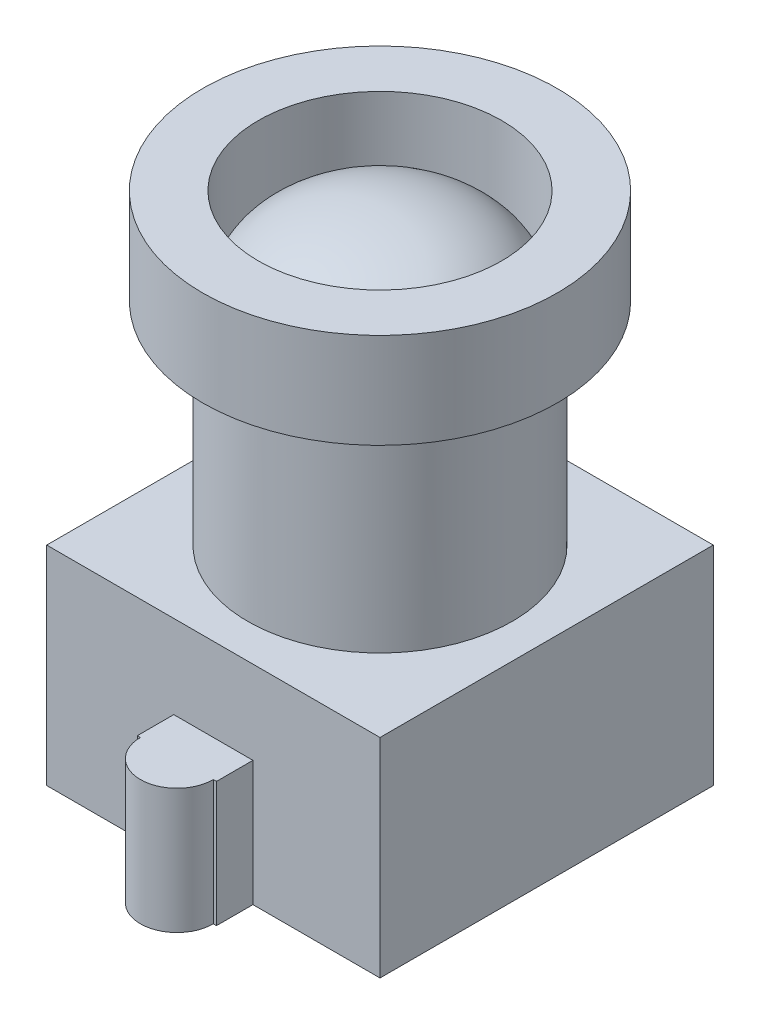
ISO-10303-21;
HEADER;
FILE_DESCRIPTION(('STEP AP214'),'2;1');
FILE_NAME('part.step','',(''),(''),'','','');
FILE_SCHEMA(('AUTOMOTIVE_DESIGN { 1 0 10303 214 1 1 1 1 }'));
ENDSEC;
DATA;
#1=APPLICATION_CONTEXT('core data for automotive mechanical design processes');
#2=APPLICATION_PROTOCOL_DEFINITION('international standard','automotive_design',2000,#1);
#3=PRODUCT_CONTEXT('',#1,'mechanical');
#4=PRODUCT('Part','Part','',(#3));
#5=PRODUCT_RELATED_PRODUCT_CATEGORY('part','',(#4));
#6=PRODUCT_DEFINITION_FORMATION('','',#4);
#7=PRODUCT_DEFINITION_CONTEXT('part definition',#1,'design');
#8=PRODUCT_DEFINITION('design','',#6,#7);
#9=PRODUCT_DEFINITION_SHAPE('','',#8);
#10=(LENGTH_UNIT() NAMED_UNIT(*) SI_UNIT(.MILLI.,.METRE.));
#11=(NAMED_UNIT(*) PLANE_ANGLE_UNIT() SI_UNIT($,.RADIAN.));
#12=(NAMED_UNIT(*) SI_UNIT($,.STERADIAN.) SOLID_ANGLE_UNIT());
#13=UNCERTAINTY_MEASURE_WITH_UNIT(LENGTH_MEASURE(1.E-05),#10,'distance_accuracy_value','');
#14=(GEOMETRIC_REPRESENTATION_CONTEXT(3) GLOBAL_UNCERTAINTY_ASSIGNED_CONTEXT((#13)) GLOBAL_UNIT_ASSIGNED_CONTEXT((#10,
#11,#12)) REPRESENTATION_CONTEXT('',''));
#15=CARTESIAN_POINT('',(0.,0.,0.));
#16=DIRECTION('',(0.,0.,1.));
#17=DIRECTION('',(1.,0.,0.));
#18=AXIS2_PLACEMENT_3D('',#15,#16,#17);
#19=CARTESIAN_POINT('',(-8.,11.6,-8.));
#20=DIRECTION('',(0.,0.,-1.));
#21=DIRECTION('',(-1.,0.,0.));
#22=AXIS2_PLACEMENT_3D('',#19,#20,#21);
#23=PLANE('',#22);
#24=DIRECTION('',(0.,-1.,0.));
#25=VECTOR('',#24,1.);
#26=CARTESIAN_POINT('',(1.9,7.6,-8.));
#27=LINE('',#26,#25);
#28=CARTESIAN_POINT('',(1.9,7.6,-8.));
#29=VERTEX_POINT('',#28);
#30=CARTESIAN_POINT('',(1.9,1.6,-8.));
#31=VERTEX_POINT('',#30);
#32=EDGE_CURVE('E161',#29,#31,#27,.T.);
#33=ORIENTED_EDGE('',*,*,#32,.F.);
#34=DIRECTION('',(1.,0.,0.));
#35=VECTOR('',#34,1.);
#36=CARTESIAN_POINT('',(-1.9,7.6,-8.));
#37=LINE('',#36,#35);
#38=CARTESIAN_POINT('',(-1.9,7.6,-8.));
#39=VERTEX_POINT('',#38);
#40=EDGE_CURVE('E148',#39,#29,#37,.T.);
#41=ORIENTED_EDGE('',*,*,#40,.F.);
#42=DIRECTION('',(0.,-1.,0.));
#43=VECTOR('',#42,1.);
#44=CARTESIAN_POINT('',(-1.9,7.6,-8.));
#45=LINE('',#44,#43);
#46=CARTESIAN_POINT('',(-1.9,1.6,-8.));
#47=VERTEX_POINT('',#46);
#48=EDGE_CURVE('E170',#39,#47,#45,.T.);
#49=ORIENTED_EDGE('',*,*,#48,.T.);
#50=DIRECTION('',(1.,0.,0.));
#51=VECTOR('',#50,1.);
#52=CARTESIAN_POINT('',(-8.,1.6,-8.));
#53=LINE('',#52,#51);
#54=CARTESIAN_POINT('',(-8.,1.6,-8.));
#55=VERTEX_POINT('',#54);
#56=EDGE_CURVE('E238',#55,#47,#53,.T.);
#57=ORIENTED_EDGE('',*,*,#56,.F.);
#58=DIRECTION('',(0.,-1.,0.));
#59=VECTOR('',#58,1.);
#60=CARTESIAN_POINT('',(-8.,11.6,-8.));
#61=LINE('',#60,#59);
#62=CARTESIAN_POINT('',(-8.,11.6,-8.));
#63=VERTEX_POINT('',#62);
#64=EDGE_CURVE('E250',#63,#55,#61,.T.);
#65=ORIENTED_EDGE('',*,*,#64,.F.);
#66=DIRECTION('',(1.,0.,0.));
#67=VECTOR('',#66,1.);
#68=CARTESIAN_POINT('',(-8.,11.6,-8.));
#69=LINE('',#68,#67);
#70=CARTESIAN_POINT('',(8.,11.6,-8.));
#71=VERTEX_POINT('',#70);
#72=EDGE_CURVE('E224',#63,#71,#69,.T.);
#73=ORIENTED_EDGE('',*,*,#72,.T.);
#74=DIRECTION('',(0.,-1.,0.));
#75=VECTOR('',#74,1.);
#76=CARTESIAN_POINT('',(8.,11.6,-8.));
#77=LINE('',#76,#75);
#78=CARTESIAN_POINT('',(8.,1.6,-8.));
#79=VERTEX_POINT('',#78);
#80=EDGE_CURVE('E237',#71,#79,#77,.T.);
#81=ORIENTED_EDGE('',*,*,#80,.T.);
#82=EDGE_CURVE('E169',#31,#79,#53,.T.);
#83=ORIENTED_EDGE('',*,*,#82,.F.);
#84=EDGE_LOOP('',(#33,#41,#49,#57,#65,#73,#81,#83));
#85=FACE_BOUND('',#84,.T.);
#86=ADVANCED_FACE('F32',(#85),#23,.T.);
#87=CARTESIAN_POINT('',(-8.,11.6,8.));
#88=DIRECTION('',(-1.,0.,0.));
#89=DIRECTION('',(0.,0.,1.));
#90=AXIS2_PLACEMENT_3D('',#87,#88,#89);
#91=PLANE('',#90);
#92=DIRECTION('',(0.,0.,-1.));
#93=VECTOR('',#92,1.);
#94=CARTESIAN_POINT('',(-8.,1.6,8.));
#95=LINE('',#94,#93);
#96=CARTESIAN_POINT('',(-8.,1.6,8.));
#97=VERTEX_POINT('',#96);
#98=EDGE_CURVE('E228',#97,#55,#95,.T.);
#99=ORIENTED_EDGE('',*,*,#98,.F.);
#100=DIRECTION('',(0.,-1.,0.));
#101=VECTOR('',#100,1.);
#102=CARTESIAN_POINT('',(-8.,11.6,8.));
#103=LINE('',#102,#101);
#104=CARTESIAN_POINT('',(-8.,11.6,8.));
#105=VERTEX_POINT('',#104);
#106=EDGE_CURVE('E252',#105,#97,#103,.T.);
#107=ORIENTED_EDGE('',*,*,#106,.F.);
#108=DIRECTION('',(0.,0.,-1.));
#109=VECTOR('',#108,1.);
#110=CARTESIAN_POINT('',(-8.,11.6,8.));
#111=LINE('',#110,#109);
#112=EDGE_CURVE('E234',#105,#63,#111,.T.);
#113=ORIENTED_EDGE('',*,*,#112,.T.);
#114=ORIENTED_EDGE('',*,*,#64,.T.);
#115=EDGE_LOOP('',(#99,#107,#113,#114));
#116=FACE_BOUND('',#115,.T.);
#117=ADVANCED_FACE('F275',(#116),#91,.T.);
#118=CARTESIAN_POINT('',(8.,11.6,8.));
#119=DIRECTION('',(0.,0.,1.));
#120=DIRECTION('',(1.,0.,0.));
#121=AXIS2_PLACEMENT_3D('',#118,#119,#120);
#122=PLANE('',#121);
#123=DIRECTION('',(0.,-1.,0.));
#124=VECTOR('',#123,1.);
#125=CARTESIAN_POINT('',(-1.9,7.6,8.));
#126=LINE('',#125,#124);
#127=CARTESIAN_POINT('',(-1.9,7.6,8.));
#128=VERTEX_POINT('',#127);
#129=CARTESIAN_POINT('',(-1.9,1.6,8.));
#130=VERTEX_POINT('',#129);
#131=EDGE_CURVE('E215',#128,#130,#126,.T.);
#132=ORIENTED_EDGE('',*,*,#131,.F.);
#133=DIRECTION('',(1.,0.,0.));
#134=VECTOR('',#133,1.);
#135=CARTESIAN_POINT('',(-1.9,7.6,8.));
#136=LINE('',#135,#134);
#137=CARTESIAN_POINT('',(1.9,7.6,8.));
#138=VERTEX_POINT('',#137);
#139=EDGE_CURVE('E194',#128,#138,#136,.T.);
#140=ORIENTED_EDGE('',*,*,#139,.T.);
#141=DIRECTION('',(0.,-1.,0.));
#142=VECTOR('',#141,1.);
#143=CARTESIAN_POINT('',(1.9,7.6,8.));
#144=LINE('',#143,#142);
#145=CARTESIAN_POINT('',(1.9,1.6,8.));
#146=VERTEX_POINT('',#145);
#147=EDGE_CURVE('E212',#138,#146,#144,.T.);
#148=ORIENTED_EDGE('',*,*,#147,.T.);
#149=DIRECTION('',(-1.,0.,0.));
#150=VECTOR('',#149,1.);
#151=CARTESIAN_POINT('',(8.,1.6,8.));
#152=LINE('',#151,#150);
#153=CARTESIAN_POINT('',(8.,1.6,8.));
#154=VERTEX_POINT('',#153);
#155=EDGE_CURVE('E245',#154,#146,#152,.T.);
#156=ORIENTED_EDGE('',*,*,#155,.F.);
#157=DIRECTION('',(0.,-1.,0.));
#158=VECTOR('',#157,1.);
#159=CARTESIAN_POINT('',(8.,11.6,8.));
#160=LINE('',#159,#158);
#161=CARTESIAN_POINT('',(8.,11.6,8.));
#162=VERTEX_POINT('',#161);
#163=EDGE_CURVE('E255',#162,#154,#160,.T.);
#164=ORIENTED_EDGE('',*,*,#163,.F.);
#165=DIRECTION('',(-1.,0.,0.));
#166=VECTOR('',#165,1.);
#167=CARTESIAN_POINT('',(8.,11.6,8.));
#168=LINE('',#167,#166);
#169=EDGE_CURVE('E231',#162,#105,#168,.T.);
#170=ORIENTED_EDGE('',*,*,#169,.T.);
#171=ORIENTED_EDGE('',*,*,#106,.T.);
#172=EDGE_CURVE('E244',#130,#97,#152,.T.);
#173=ORIENTED_EDGE('',*,*,#172,.F.);
#174=EDGE_LOOP('',(#132,#140,#148,#156,#164,#170,#171,#173));
#175=FACE_BOUND('',#174,.T.);
#176=ADVANCED_FACE('F280',(#175),#122,.T.);
#177=CARTESIAN_POINT('',(8.,11.6,-8.));
#178=DIRECTION('',(1.,0.,0.));
#179=DIRECTION('',(0.,0.,-1.));
#180=AXIS2_PLACEMENT_3D('',#177,#178,#179);
#181=PLANE('',#180);
#182=DIRECTION('',(0.,0.,1.));
#183=VECTOR('',#182,1.);
#184=CARTESIAN_POINT('',(8.,1.6,-8.));
#185=LINE('',#184,#183);
#186=EDGE_CURVE('E241',#79,#154,#185,.T.);
#187=ORIENTED_EDGE('',*,*,#186,.F.);
#188=ORIENTED_EDGE('',*,*,#80,.F.);
#189=DIRECTION('',(0.,0.,1.));
#190=VECTOR('',#189,1.);
#191=CARTESIAN_POINT('',(8.,11.6,-8.));
#192=LINE('',#191,#190);
#193=EDGE_CURVE('E227',#71,#162,#192,.T.);
#194=ORIENTED_EDGE('',*,*,#193,.T.);
#195=ORIENTED_EDGE('',*,*,#163,.T.);
#196=EDGE_LOOP('',(#187,#188,#194,#195));
#197=FACE_BOUND('',#196,.T.);
#198=ADVANCED_FACE('F267',(#197),#181,.T.);
#199=CARTESIAN_POINT('',(0.,11.6,0.));
#200=DIRECTION('',(0.,-1.,0.));
#201=DIRECTION('',(0.,0.,-1.));
#202=AXIS2_PLACEMENT_3D('',#199,#200,#201);
#203=PLANE('',#202);
#204=CARTESIAN_POINT('',(0.,11.6,0.));
#205=DIRECTION('',(0.,-1.,0.));
#206=DIRECTION('',(0.,0.,-1.));
#207=AXIS2_PLACEMENT_3D('',#204,#205,#206);
#208=CIRCLE('',#207,6.35);
#209=CARTESIAN_POINT('',(0.,11.6,-6.35));
#210=VERTEX_POINT('',#209);
#211=EDGE_CURVE('E41',#210,#210,#208,.F.);
#212=ORIENTED_EDGE('',*,*,#211,.F.);
#213=EDGE_LOOP('',(#212));
#214=FACE_BOUND('',#213,.T.);
#215=ORIENTED_EDGE('',*,*,#72,.F.);
#216=ORIENTED_EDGE('',*,*,#112,.F.);
#217=ORIENTED_EDGE('',*,*,#169,.F.);
#218=ORIENTED_EDGE('',*,*,#193,.F.);
#219=EDGE_LOOP('',(#215,#216,#217,#218));
#220=FACE_BOUND('',#219,.T.);
#221=ADVANCED_FACE('F263',(#214,#220),#203,.F.);
#222=CARTESIAN_POINT('',(0.,1.6,0.));
#223=DIRECTION('',(0.,-1.,0.));
#224=DIRECTION('',(0.,0.,-1.));
#225=AXIS2_PLACEMENT_3D('',#222,#223,#224);
#226=PLANE('',#225);
#227=ORIENTED_EDGE('',*,*,#56,.T.);
#228=DIRECTION('',(0.,0.,1.));
#229=VECTOR('',#228,1.);
#230=CARTESIAN_POINT('',(-1.9,1.6,-9.75));
#231=LINE('',#230,#229);
#232=CARTESIAN_POINT('',(-1.9,1.6,-9.75));
#233=VERTEX_POINT('',#232);
#234=EDGE_CURVE('E51',#233,#47,#231,.T.);
#235=ORIENTED_EDGE('',*,*,#234,.F.);
#236=DIRECTION('',(-1.,0.,0.));
#237=VECTOR('',#236,1.);
#238=CARTESIAN_POINT('',(-1.75,1.6,-9.75));
#239=LINE('',#238,#237);
#240=CARTESIAN_POINT('',(-1.75,1.6,-9.75));
#241=VERTEX_POINT('',#240);
#242=EDGE_CURVE('E289',#241,#233,#239,.T.);
#243=ORIENTED_EDGE('',*,*,#242,.F.);
#244=CARTESIAN_POINT('',(0.,1.6,-9.75));
#245=DIRECTION('',(0.,1.,0.));
#246=DIRECTION('',(0.,0.,1.));
#247=AXIS2_PLACEMENT_3D('',#244,#245,#246);
#248=CIRCLE('',#247,1.75);
#249=CARTESIAN_POINT('',(1.75,1.6,-9.75));
#250=VERTEX_POINT('',#249);
#251=EDGE_CURVE('E297',#250,#241,#248,.T.);
#252=ORIENTED_EDGE('',*,*,#251,.F.);
#253=DIRECTION('',(-1.,0.,0.));
#254=VECTOR('',#253,1.);
#255=CARTESIAN_POINT('',(1.9,1.6,-9.75));
#256=LINE('',#255,#254);
#257=CARTESIAN_POINT('',(1.9,1.6,-9.75));
#258=VERTEX_POINT('',#257);
#259=EDGE_CURVE('E165',#258,#250,#256,.T.);
#260=ORIENTED_EDGE('',*,*,#259,.F.);
#261=DIRECTION('',(0.,0.,-1.));
#262=VECTOR('',#261,1.);
#263=CARTESIAN_POINT('',(1.9,1.6,-8.));
#264=LINE('',#263,#262);
#265=EDGE_CURVE('E285',#31,#258,#264,.T.);
#266=ORIENTED_EDGE('',*,*,#265,.F.);
#267=ORIENTED_EDGE('',*,*,#82,.T.);
#268=ORIENTED_EDGE('',*,*,#186,.T.);
#269=ORIENTED_EDGE('',*,*,#155,.T.);
#270=DIRECTION('',(0.,0.,1.));
#271=VECTOR('',#270,1.);
#272=CARTESIAN_POINT('',(1.9,1.6,8.));
#273=LINE('',#272,#271);
#274=CARTESIAN_POINT('',(1.9,1.6,9.75));
#275=VERTEX_POINT('',#274);
#276=EDGE_CURVE('E198',#146,#275,#273,.T.);
#277=ORIENTED_EDGE('',*,*,#276,.T.);
#278=DIRECTION('',(-1.,0.,0.));
#279=VECTOR('',#278,1.);
#280=CARTESIAN_POINT('',(1.9,1.6,9.75));
#281=LINE('',#280,#279);
#282=CARTESIAN_POINT('',(1.75,1.6,9.75));
#283=VERTEX_POINT('',#282);
#284=EDGE_CURVE('E201',#275,#283,#281,.T.);
#285=ORIENTED_EDGE('',*,*,#284,.T.);
#286=CARTESIAN_POINT('',(0.,1.6,9.75));
#287=DIRECTION('',(0.,-1.,0.));
#288=DIRECTION('',(0.,0.,-1.));
#289=AXIS2_PLACEMENT_3D('',#286,#287,#288);
#290=CIRCLE('',#289,1.75);
#291=CARTESIAN_POINT('',(-1.75,1.6,9.75));
#292=VERTEX_POINT('',#291);
#293=EDGE_CURVE('E204',#283,#292,#290,.T.);
#294=ORIENTED_EDGE('',*,*,#293,.T.);
#295=DIRECTION('',(-1.,0.,0.));
#296=VECTOR('',#295,1.);
#297=CARTESIAN_POINT('',(-1.75,1.6,9.75));
#298=LINE('',#297,#296);
#299=CARTESIAN_POINT('',(-1.9,1.6,9.75));
#300=VERTEX_POINT('',#299);
#301=EDGE_CURVE('E207',#292,#300,#298,.T.);
#302=ORIENTED_EDGE('',*,*,#301,.T.);
#303=DIRECTION('',(0.,0.,-1.));
#304=VECTOR('',#303,1.);
#305=CARTESIAN_POINT('',(-1.9,1.6,9.75));
#306=LINE('',#305,#304);
#307=EDGE_CURVE('E183',#300,#130,#306,.T.);
#308=ORIENTED_EDGE('',*,*,#307,.T.);
#309=ORIENTED_EDGE('',*,*,#172,.T.);
#310=ORIENTED_EDGE('',*,*,#98,.T.);
#311=EDGE_LOOP('',(#227,#235,#243,#252,#260,#266,#267,#268,#269,#277,#285,#294,#302,#308,#309,#310));
#312=FACE_BOUND('',#311,.T.);
#313=ADVANCED_FACE('F266',(#312),#226,.T.);
#314=CARTESIAN_POINT('',(1.9,7.6,8.));
#315=DIRECTION('',(1.,0.,0.));
#316=DIRECTION('',(0.,0.,-1.));
#317=AXIS2_PLACEMENT_3D('',#314,#315,#316);
#318=PLANE('',#317);
#319=ORIENTED_EDGE('',*,*,#276,.F.);
#320=ORIENTED_EDGE('',*,*,#147,.F.);
#321=DIRECTION('',(0.,0.,1.));
#322=VECTOR('',#321,1.);
#323=CARTESIAN_POINT('',(1.9,7.6,8.));
#324=LINE('',#323,#322);
#325=CARTESIAN_POINT('',(1.9,7.6,9.75));
#326=VERTEX_POINT('',#325);
#327=EDGE_CURVE('E179',#138,#326,#324,.T.);
#328=ORIENTED_EDGE('',*,*,#327,.T.);
#329=DIRECTION('',(0.,-1.,0.));
#330=VECTOR('',#329,1.);
#331=CARTESIAN_POINT('',(1.9,7.6,9.75));
#332=LINE('',#331,#330);
#333=EDGE_CURVE('E197',#326,#275,#332,.T.);
#334=ORIENTED_EDGE('',*,*,#333,.T.);
#335=EDGE_LOOP('',(#319,#320,#328,#334));
#336=FACE_BOUND('',#335,.T.);
#337=ADVANCED_FACE('F323',(#336),#318,.T.);
#338=CARTESIAN_POINT('',(-1.9,7.6,9.75));
#339=DIRECTION('',(-1.,0.,0.));
#340=DIRECTION('',(0.,0.,1.));
#341=AXIS2_PLACEMENT_3D('',#338,#339,#340);
#342=PLANE('',#341);
#343=ORIENTED_EDGE('',*,*,#307,.F.);
#344=DIRECTION('',(0.,-1.,0.));
#345=VECTOR('',#344,1.);
#346=CARTESIAN_POINT('',(-1.9,7.6,9.75));
#347=LINE('',#346,#345);
#348=CARTESIAN_POINT('',(-1.9,7.6,9.75));
#349=VERTEX_POINT('',#348);
#350=EDGE_CURVE('E217',#349,#300,#347,.T.);
#351=ORIENTED_EDGE('',*,*,#350,.F.);
#352=DIRECTION('',(0.,0.,-1.));
#353=VECTOR('',#352,1.);
#354=CARTESIAN_POINT('',(-1.9,7.6,9.75));
#355=LINE('',#354,#353);
#356=EDGE_CURVE('E192',#349,#128,#355,.T.);
#357=ORIENTED_EDGE('',*,*,#356,.T.);
#358=ORIENTED_EDGE('',*,*,#131,.T.);
#359=EDGE_LOOP('',(#343,#351,#357,#358));
#360=FACE_BOUND('',#359,.T.);
#361=ADVANCED_FACE('F314',(#360),#342,.T.);
#362=CARTESIAN_POINT('',(-1.75,7.6,9.75));
#363=DIRECTION('',(0.,0.,1.));
#364=DIRECTION('',(1.,0.,0.));
#365=AXIS2_PLACEMENT_3D('',#362,#363,#364);
#366=PLANE('',#365);
#367=ORIENTED_EDGE('',*,*,#301,.F.);
#368=DIRECTION('',(0.,-1.,0.));
#369=VECTOR('',#368,1.);
#370=CARTESIAN_POINT('',(-1.75,7.6,9.75));
#371=LINE('',#370,#369);
#372=CARTESIAN_POINT('',(-1.75,7.6,9.75));
#373=VERTEX_POINT('',#372);
#374=EDGE_CURVE('E219',#373,#292,#371,.T.);
#375=ORIENTED_EDGE('',*,*,#374,.F.);
#376=DIRECTION('',(-1.,0.,0.));
#377=VECTOR('',#376,1.);
#378=CARTESIAN_POINT('',(-1.75,7.6,9.75));
#379=LINE('',#378,#377);
#380=EDGE_CURVE('E189',#373,#349,#379,.T.);
#381=ORIENTED_EDGE('',*,*,#380,.T.);
#382=ORIENTED_EDGE('',*,*,#350,.T.);
#383=EDGE_LOOP('',(#367,#375,#381,#382));
#384=FACE_BOUND('',#383,.T.);
#385=ADVANCED_FACE('F332',(#384),#366,.T.);
#386=CARTESIAN_POINT('',(0.,7.6,9.75));
#387=DIRECTION('',(0.,-1.,0.));
#388=DIRECTION('',(0.,0.,-1.));
#389=AXIS2_PLACEMENT_3D('',#386,#387,#388);
#390=CYLINDRICAL_SURFACE('',#389,1.75);
#391=ORIENTED_EDGE('',*,*,#293,.F.);
#392=DIRECTION('',(0.,-1.,0.));
#393=VECTOR('',#392,1.);
#394=CARTESIAN_POINT('',(1.75,7.6,9.75));
#395=LINE('',#394,#393);
#396=CARTESIAN_POINT('',(1.75,7.6,9.75));
#397=VERTEX_POINT('',#396);
#398=EDGE_CURVE('E221',#397,#283,#395,.T.);
#399=ORIENTED_EDGE('',*,*,#398,.F.);
#400=CARTESIAN_POINT('',(0.,7.6,9.75));
#401=DIRECTION('',(0.,-1.,0.));
#402=DIRECTION('',(0.,0.,-1.));
#403=AXIS2_PLACEMENT_3D('',#400,#401,#402);
#404=CIRCLE('',#403,1.75);
#405=EDGE_CURVE('E186',#397,#373,#404,.T.);
#406=ORIENTED_EDGE('',*,*,#405,.T.);
#407=ORIENTED_EDGE('',*,*,#374,.T.);
#408=EDGE_LOOP('',(#391,#399,#406,#407));
#409=FACE_BOUND('',#408,.T.);
#410=ADVANCED_FACE('F329',(#409),#390,.T.);
#411=CARTESIAN_POINT('',(1.9,7.6,9.75));
#412=DIRECTION('',(0.,0.,1.));
#413=DIRECTION('',(1.,0.,0.));
#414=AXIS2_PLACEMENT_3D('',#411,#412,#413);
#415=PLANE('',#414);
#416=ORIENTED_EDGE('',*,*,#284,.F.);
#417=ORIENTED_EDGE('',*,*,#333,.F.);
#418=DIRECTION('',(-1.,0.,0.));
#419=VECTOR('',#418,1.);
#420=CARTESIAN_POINT('',(1.9,7.6,9.75));
#421=LINE('',#420,#419);
#422=EDGE_CURVE('E182',#326,#397,#421,.T.);
#423=ORIENTED_EDGE('',*,*,#422,.T.);
#424=ORIENTED_EDGE('',*,*,#398,.T.);
#425=EDGE_LOOP('',(#416,#417,#423,#424));
#426=FACE_BOUND('',#425,.T.);
#427=ADVANCED_FACE('F327',(#426),#415,.T.);
#428=CARTESIAN_POINT('',(0.,7.6,9.75));
#429=DIRECTION('',(0.,-1.,0.));
#430=DIRECTION('',(0.,0.,-1.));
#431=AXIS2_PLACEMENT_3D('',#428,#429,#430);
#432=PLANE('',#431);
#433=ORIENTED_EDGE('',*,*,#327,.F.);
#434=ORIENTED_EDGE('',*,*,#139,.F.);
#435=ORIENTED_EDGE('',*,*,#356,.F.);
#436=ORIENTED_EDGE('',*,*,#380,.F.);
#437=ORIENTED_EDGE('',*,*,#405,.F.);
#438=ORIENTED_EDGE('',*,*,#422,.F.);
#439=EDGE_LOOP('',(#433,#434,#435,#436,#437,#438));
#440=FACE_BOUND('',#439,.T.);
#441=ADVANCED_FACE('F319',(#440),#432,.F.);
#442=CARTESIAN_POINT('',(1.9,7.6,-8.));
#443=DIRECTION('',(-1.,0.,0.));
#444=DIRECTION('',(0.,0.,1.));
#445=AXIS2_PLACEMENT_3D('',#442,#443,#444);
#446=PLANE('',#445);
#447=ORIENTED_EDGE('',*,*,#265,.T.);
#448=DIRECTION('',(0.,-1.,0.));
#449=VECTOR('',#448,1.);
#450=CARTESIAN_POINT('',(1.9,7.6,-9.75));
#451=LINE('',#450,#449);
#452=CARTESIAN_POINT('',(1.9,7.6,-9.75));
#453=VERTEX_POINT('',#452);
#454=EDGE_CURVE('E164',#453,#258,#451,.T.);
#455=ORIENTED_EDGE('',*,*,#454,.F.);
#456=DIRECTION('',(0.,0.,-1.));
#457=VECTOR('',#456,1.);
#458=CARTESIAN_POINT('',(1.9,7.6,-8.));
#459=LINE('',#458,#457);
#460=EDGE_CURVE('E151',#29,#453,#459,.T.);
#461=ORIENTED_EDGE('',*,*,#460,.F.);
#462=ORIENTED_EDGE('',*,*,#32,.T.);
#463=EDGE_LOOP('',(#447,#455,#461,#462));
#464=FACE_BOUND('',#463,.T.);
#465=ADVANCED_FACE('F160',(#464),#446,.F.);
#466=CARTESIAN_POINT('',(1.9,7.6,-9.75));
#467=DIRECTION('',(0.,0.,1.));
#468=DIRECTION('',(1.,0.,0.));
#469=AXIS2_PLACEMENT_3D('',#466,#467,#468);
#470=PLANE('',#469);
#471=ORIENTED_EDGE('',*,*,#259,.T.);
#472=DIRECTION('',(0.,-1.,0.));
#473=VECTOR('',#472,1.);
#474=CARTESIAN_POINT('',(1.75,7.6,-9.75));
#475=LINE('',#474,#473);
#476=CARTESIAN_POINT('',(1.75,7.6,-9.75));
#477=VERTEX_POINT('',#476);
#478=EDGE_CURVE('E301',#477,#250,#475,.T.);
#479=ORIENTED_EDGE('',*,*,#478,.F.);
#480=DIRECTION('',(-1.,0.,0.));
#481=VECTOR('',#480,1.);
#482=CARTESIAN_POINT('',(1.9,7.6,-9.75));
#483=LINE('',#482,#481);
#484=EDGE_CURVE('E171',#453,#477,#483,.T.);
#485=ORIENTED_EDGE('',*,*,#484,.F.);
#486=ORIENTED_EDGE('',*,*,#454,.T.);
#487=EDGE_LOOP('',(#471,#479,#485,#486));
#488=FACE_BOUND('',#487,.T.);
#489=ADVANCED_FACE('F363',(#488),#470,.F.);
#490=CARTESIAN_POINT('',(0.,7.6,-9.75));
#491=DIRECTION('',(0.,-1.,0.));
#492=DIRECTION('',(0.,0.,-1.));
#493=AXIS2_PLACEMENT_3D('',#490,#491,#492);
#494=CYLINDRICAL_SURFACE('',#493,1.75);
#495=ORIENTED_EDGE('',*,*,#251,.T.);
#496=DIRECTION('',(0.,-1.,0.));
#497=VECTOR('',#496,1.);
#498=CARTESIAN_POINT('',(-1.75,7.6,-9.75));
#499=LINE('',#498,#497);
#500=CARTESIAN_POINT('',(-1.75,7.6,-9.75));
#501=VERTEX_POINT('',#500);
#502=EDGE_CURVE('E304',#501,#241,#499,.T.);
#503=ORIENTED_EDGE('',*,*,#502,.F.);
#504=CARTESIAN_POINT('',(0.,7.6,-9.75));
#505=DIRECTION('',(0.,1.,0.));
#506=DIRECTION('',(0.,0.,1.));
#507=AXIS2_PLACEMENT_3D('',#504,#505,#506);
#508=CIRCLE('',#507,1.75);
#509=EDGE_CURVE('E175',#477,#501,#508,.T.);
#510=ORIENTED_EDGE('',*,*,#509,.F.);
#511=ORIENTED_EDGE('',*,*,#478,.T.);
#512=EDGE_LOOP('',(#495,#503,#510,#511));
#513=FACE_BOUND('',#512,.T.);
#514=ADVANCED_FACE('F371',(#513),#494,.T.);
#515=CARTESIAN_POINT('',(-1.75,7.6,-9.75));
#516=DIRECTION('',(0.,0.,1.));
#517=DIRECTION('',(1.,0.,0.));
#518=AXIS2_PLACEMENT_3D('',#515,#516,#517);
#519=PLANE('',#518);
#520=ORIENTED_EDGE('',*,*,#242,.T.);
#521=DIRECTION('',(0.,-1.,0.));
#522=VECTOR('',#521,1.);
#523=CARTESIAN_POINT('',(-1.9,7.6,-9.75));
#524=LINE('',#523,#522);
#525=CARTESIAN_POINT('',(-1.9,7.6,-9.75));
#526=VERTEX_POINT('',#525);
#527=EDGE_CURVE('E173',#526,#233,#524,.T.);
#528=ORIENTED_EDGE('',*,*,#527,.F.);
#529=DIRECTION('',(-1.,0.,0.));
#530=VECTOR('',#529,1.);
#531=CARTESIAN_POINT('',(-1.75,7.6,-9.75));
#532=LINE('',#531,#530);
#533=EDGE_CURVE('E416',#501,#526,#532,.T.);
#534=ORIENTED_EDGE('',*,*,#533,.F.);
#535=ORIENTED_EDGE('',*,*,#502,.T.);
#536=EDGE_LOOP('',(#520,#528,#534,#535));
#537=FACE_BOUND('',#536,.T.);
#538=ADVANCED_FACE('F368',(#537),#519,.F.);
#539=CARTESIAN_POINT('',(-1.9,7.6,-9.75));
#540=DIRECTION('',(1.,0.,0.));
#541=DIRECTION('',(0.,0.,-1.));
#542=AXIS2_PLACEMENT_3D('',#539,#540,#541);
#543=PLANE('',#542);
#544=ORIENTED_EDGE('',*,*,#234,.T.);
#545=ORIENTED_EDGE('',*,*,#48,.F.);
#546=DIRECTION('',(0.,0.,1.));
#547=VECTOR('',#546,1.);
#548=CARTESIAN_POINT('',(-1.9,7.6,-9.75));
#549=LINE('',#548,#547);
#550=EDGE_CURVE('E154',#526,#39,#549,.T.);
#551=ORIENTED_EDGE('',*,*,#550,.F.);
#552=ORIENTED_EDGE('',*,*,#527,.T.);
#553=EDGE_LOOP('',(#544,#545,#551,#552));
#554=FACE_BOUND('',#553,.T.);
#555=ADVANCED_FACE('F307',(#554),#543,.F.);
#556=CARTESIAN_POINT('',(0.,7.6,-9.75));
#557=DIRECTION('',(0.,-1.,0.));
#558=DIRECTION('',(0.,0.,1.));
#559=AXIS2_PLACEMENT_3D('',#556,#557,#558);
#560=PLANE('',#559);
#561=ORIENTED_EDGE('',*,*,#460,.T.);
#562=ORIENTED_EDGE('',*,*,#484,.T.);
#563=ORIENTED_EDGE('',*,*,#509,.T.);
#564=ORIENTED_EDGE('',*,*,#533,.T.);
#565=ORIENTED_EDGE('',*,*,#550,.T.);
#566=ORIENTED_EDGE('',*,*,#40,.T.);
#567=EDGE_LOOP('',(#561,#562,#563,#564,#565,#566));
#568=FACE_BOUND('',#567,.T.);
#569=ADVANCED_FACE('F150',(#568),#560,.F.);
#570=CARTESIAN_POINT('',(0.,21.76,0.));
#571=DIRECTION('',(0.,-1.,0.));
#572=DIRECTION('',(0.,0.,-1.));
#573=AXIS2_PLACEMENT_3D('',#570,#571,#572);
#574=CYLINDRICAL_SURFACE('',#573,6.35);
#575=CARTESIAN_POINT('',(0.,21.76,0.));
#576=DIRECTION('',(0.,1.,0.));
#577=DIRECTION('',(0.,0.,1.));
#578=AXIS2_PLACEMENT_3D('',#575,#576,#577);
#579=CIRCLE('',#578,6.35);
#580=CARTESIAN_POINT('',(0.,21.76,6.35));
#581=VERTEX_POINT('',#580);
#582=EDGE_CURVE('E287',#581,#581,#579,.T.);
#583=ORIENTED_EDGE('',*,*,#582,.F.);
#584=EDGE_LOOP('',(#583));
#585=FACE_BOUND('',#584,.T.);
#586=ORIENTED_EDGE('',*,*,#211,.T.);
#587=EDGE_LOOP('',(#586));
#588=FACE_BOUND('',#587,.T.);
#589=ADVANCED_FACE('F261',(#585,#588),#574,.T.);
#590=CARTESIAN_POINT('',(0.,26.332,0.));
#591=DIRECTION('',(0.,1.,0.));
#592=DIRECTION('',(0.,0.,1.));
#593=AXIS2_PLACEMENT_3D('',#590,#591,#592);
#594=PLANE('',#593);
#595=CARTESIAN_POINT('',(0.,26.332,0.));
#596=DIRECTION('',(0.,1.,0.));
#597=DIRECTION('',(0.,0.,1.));
#598=AXIS2_PLACEMENT_3D('',#595,#596,#597);
#599=CIRCLE('',#598,8.509);
#600=CARTESIAN_POINT('',(0.,26.332,8.509));
#601=VERTEX_POINT('',#600);
#602=EDGE_CURVE('E292',#601,#601,#599,.T.);
#603=ORIENTED_EDGE('',*,*,#602,.T.);
#604=EDGE_LOOP('',(#603));
#605=FACE_BOUND('',#604,.T.);
#606=CARTESIAN_POINT('',(0.,26.332,0.));
#607=DIRECTION('',(0.,1.,0.));
#608=DIRECTION('',(0.,0.,1.));
#609=AXIS2_PLACEMENT_3D('',#606,#607,#608);
#610=CIRCLE('',#609,5.842);
#611=CARTESIAN_POINT('',(0.,26.332,5.842));
#612=VERTEX_POINT('',#611);
#613=EDGE_CURVE('E404',#612,#612,#610,.T.);
#614=ORIENTED_EDGE('',*,*,#613,.F.);
#615=EDGE_LOOP('',(#614));
#616=FACE_BOUND('',#615,.T.);
#617=ADVANCED_FACE('F382',(#605,#616),#594,.T.);
#618=CARTESIAN_POINT('',(0.,21.76,0.));
#619=DIRECTION('',(0.,1.,0.));
#620=DIRECTION('',(0.,0.,1.));
#621=AXIS2_PLACEMENT_3D('',#618,#619,#620);
#622=PLANE('',#621);
#623=ORIENTED_EDGE('',*,*,#582,.T.);
#624=EDGE_LOOP('',(#623));
#625=FACE_BOUND('',#624,.T.);
#626=CARTESIAN_POINT('',(0.,21.76,0.));
#627=DIRECTION('',(0.,1.,0.));
#628=DIRECTION('',(0.,0.,1.));
#629=AXIS2_PLACEMENT_3D('',#626,#627,#628);
#630=CIRCLE('',#629,8.509);
#631=CARTESIAN_POINT('',(0.,21.76,8.509));
#632=VERTEX_POINT('',#631);
#633=EDGE_CURVE('E408',#632,#632,#630,.T.);
#634=ORIENTED_EDGE('',*,*,#633,.F.);
#635=EDGE_LOOP('',(#634));
#636=FACE_BOUND('',#635,.T.);
#637=ADVANCED_FACE('F388',(#625,#636),#622,.F.);
#638=CARTESIAN_POINT('',(0.,26.332,0.));
#639=DIRECTION('',(0.,-1.,0.));
#640=DIRECTION('',(0.,0.,-1.));
#641=AXIS2_PLACEMENT_3D('',#638,#639,#640);
#642=CYLINDRICAL_SURFACE('',#641,8.509);
#643=ORIENTED_EDGE('',*,*,#602,.F.);
#644=EDGE_LOOP('',(#643));
#645=FACE_BOUND('',#644,.T.);
#646=ORIENTED_EDGE('',*,*,#633,.T.);
#647=EDGE_LOOP('',(#646));
#648=FACE_BOUND('',#647,.T.);
#649=ADVANCED_FACE('F384',(#645,#648),#642,.T.);
#650=CARTESIAN_POINT('',(0.,26.332,0.));
#651=DIRECTION('',(0.,-1.,0.));
#652=DIRECTION('',(0.,0.,-1.));
#653=AXIS2_PLACEMENT_3D('',#650,#651,#652);
#654=CYLINDRICAL_SURFACE('',#653,5.842);
#655=ORIENTED_EDGE('',*,*,#613,.T.);
#656=EDGE_LOOP('',(#655));
#657=FACE_BOUND('',#656,.T.);
#658=CARTESIAN_POINT('',(0.,21.76,0.));
#659=DIRECTION('',(0.,1.,0.));
#660=DIRECTION('',(0.,0.,1.));
#661=AXIS2_PLACEMENT_3D('',#658,#659,#660);
#662=CIRCLE('',#661,5.842);
#663=CARTESIAN_POINT('',(0.,21.76,5.842));
#664=VERTEX_POINT('',#663);
#665=EDGE_CURVE('E11',#664,#664,#662,.F.);
#666=ORIENTED_EDGE('',*,*,#665,.T.);
#667=EDGE_LOOP('',(#666));
#668=FACE_BOUND('',#667,.T.);
#669=ADVANCED_FACE('F387',(#657,#668),#654,.F.);
#670=CARTESIAN_POINT('',(0.,21.76,0.));
#671=DIRECTION('',(1.,0.,0.));
#672=DIRECTION('',(0.,0.,1.));
#673=AXIS2_PLACEMENT_3D('',#670,#671,#672);
#674=ELLIPSE('',#673,5.842,3.81);
#675=TRIMMED_CURVE('',#674,(PARAMETER_VALUE(4.71238898038469)),
(PARAMETER_VALUE(7.85398163397448)),.T.,.PARAMETER.);
#676=CARTESIAN_POINT('',(0.,17.95,0.));
#677=DIRECTION('',(0.,1.,0.));
#678=AXIS1_PLACEMENT('',#676,#677);
#679=SURFACE_OF_REVOLUTION('',#675,#678);
#680=CARTESIAN_POINT('',(0.,25.57,0.));
#681=VERTEX_POINT('',#680);
#682=VERTEX_LOOP('',#681);
#683=FACE_BOUND('',#682,.T.);
#684=ORIENTED_EDGE('',*,*,#665,.F.);
#685=EDGE_LOOP('',(#684));
#686=FACE_BOUND('',#685,.T.);
#687=ADVANCED_FACE('F34',(#683,#686),#679,.F.);
#688=CLOSED_SHELL('',(#86,#117,#176,#198,#221,#313,#337,#361,#385,#410,#427,#441,#465,#489,#514,
#538,#555,#569,#589,#617,#637,#649,#669,#687));
#689=MANIFOLD_SOLID_BREP('B2',#688);
#690=ADVANCED_BREP_SHAPE_REPRESENTATION('',(#18,#689),#14);
#691=SHAPE_DEFINITION_REPRESENTATION(#9,#690);
ENDSEC;
END-ISO-10303-21;
